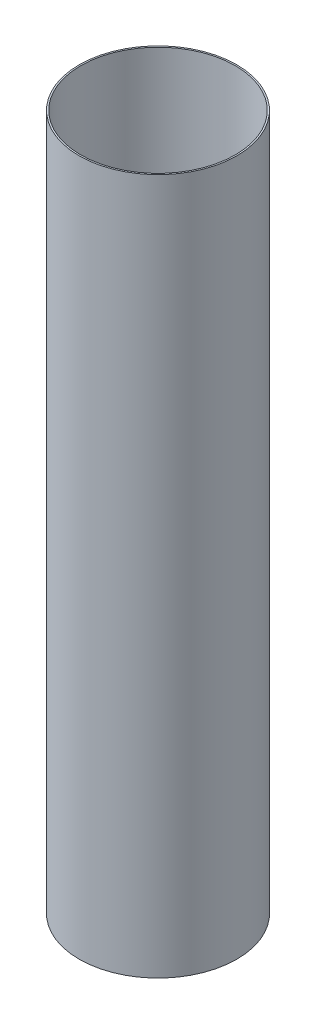
ISO-10303-21;
HEADER;
FILE_DESCRIPTION(('STEP AP214'),'2;1');
FILE_NAME('part.step','',(''),(''),'','','');
FILE_SCHEMA(('AUTOMOTIVE_DESIGN { 1 0 10303 214 1 1 1 1 }'));
ENDSEC;
DATA;
#1=APPLICATION_CONTEXT('core data for automotive mechanical design processes');
#2=APPLICATION_PROTOCOL_DEFINITION('international standard','automotive_design',2000,#1);
#3=PRODUCT_CONTEXT('',#1,'mechanical');
#4=PRODUCT('Part','Part','',(#3));
#5=PRODUCT_RELATED_PRODUCT_CATEGORY('part','',(#4));
#6=PRODUCT_DEFINITION_FORMATION('','',#4);
#7=PRODUCT_DEFINITION_CONTEXT('part definition',#1,'design');
#8=PRODUCT_DEFINITION('design','',#6,#7);
#9=PRODUCT_DEFINITION_SHAPE('','',#8);
#10=(LENGTH_UNIT() NAMED_UNIT(*) SI_UNIT(.MILLI.,.METRE.));
#11=(NAMED_UNIT(*) PLANE_ANGLE_UNIT() SI_UNIT($,.RADIAN.));
#12=(NAMED_UNIT(*) SI_UNIT($,.STERADIAN.) SOLID_ANGLE_UNIT());
#13=UNCERTAINTY_MEASURE_WITH_UNIT(LENGTH_MEASURE(1.E-05),#10,'distance_accuracy_value','');
#14=(GEOMETRIC_REPRESENTATION_CONTEXT(3) GLOBAL_UNCERTAINTY_ASSIGNED_CONTEXT((#13)) GLOBAL_UNIT_ASSIGNED_CONTEXT((#10,
#11,#12)) REPRESENTATION_CONTEXT('',''));
#15=CARTESIAN_POINT('',(0.,0.,0.));
#16=DIRECTION('',(0.,0.,1.));
#17=DIRECTION('',(1.,0.,0.));
#18=AXIS2_PLACEMENT_3D('',#15,#16,#17);
#19=CARTESIAN_POINT('',(0.,450.,0.));
#20=DIRECTION('',(0.,1.,0.));
#21=DIRECTION('',(0.,0.,1.));
#22=AXIS2_PLACEMENT_3D('',#19,#20,#21);
#23=PLANE('',#22);
#24=CARTESIAN_POINT('',(0.,450.,0.));
#25=DIRECTION('',(0.,1.,0.));
#26=DIRECTION('',(0.,0.,1.));
#27=AXIS2_PLACEMENT_3D('',#24,#25,#26);
#28=CIRCLE('',#27,51.);
#29=CARTESIAN_POINT('',(0.,450.,51.));
#30=VERTEX_POINT('',#29);
#31=EDGE_CURVE('E10',#30,#30,#28,.T.);
#32=ORIENTED_EDGE('',*,*,#31,.T.);
#33=EDGE_LOOP('',(#32));
#34=FACE_BOUND('',#33,.T.);
#35=CARTESIAN_POINT('',(0.,450.,0.));
#36=DIRECTION('',(0.,1.,0.));
#37=DIRECTION('',(0.,0.,1.));
#38=AXIS2_PLACEMENT_3D('',#35,#36,#37);
#39=CIRCLE('',#38,50.);
#40=CARTESIAN_POINT('',(0.,450.,50.));
#41=VERTEX_POINT('',#40);
#42=EDGE_CURVE('E54',#41,#41,#39,.T.);
#43=ORIENTED_EDGE('',*,*,#42,.F.);
#44=EDGE_LOOP('',(#43));
#45=FACE_BOUND('',#44,.T.);
#46=ADVANCED_FACE('F41',(#34,#45),#23,.T.);
#47=CARTESIAN_POINT('',(0.,0.,0.));
#48=DIRECTION('',(0.,1.,0.));
#49=DIRECTION('',(0.,0.,1.));
#50=AXIS2_PLACEMENT_3D('',#47,#48,#49);
#51=PLANE('',#50);
#52=CARTESIAN_POINT('',(0.,0.,0.));
#53=DIRECTION('',(0.,1.,0.));
#54=DIRECTION('',(0.,0.,1.));
#55=AXIS2_PLACEMENT_3D('',#52,#53,#54);
#56=CIRCLE('',#55,51.);
#57=CARTESIAN_POINT('',(0.,0.,51.));
#58=VERTEX_POINT('',#57);
#59=EDGE_CURVE('E45',#58,#58,#56,.T.);
#60=ORIENTED_EDGE('',*,*,#59,.F.);
#61=EDGE_LOOP('',(#60));
#62=FACE_BOUND('',#61,.T.);
#63=CARTESIAN_POINT('',(0.,0.,0.));
#64=DIRECTION('',(0.,1.,0.));
#65=DIRECTION('',(0.,0.,1.));
#66=AXIS2_PLACEMENT_3D('',#63,#64,#65);
#67=CIRCLE('',#66,50.);
#68=CARTESIAN_POINT('',(0.,0.,50.));
#69=VERTEX_POINT('',#68);
#70=EDGE_CURVE('E56',#69,#69,#67,.T.);
#71=ORIENTED_EDGE('',*,*,#70,.T.);
#72=EDGE_LOOP('',(#71));
#73=FACE_BOUND('',#72,.T.);
#74=ADVANCED_FACE('F68',(#62,#73),#51,.F.);
#75=CARTESIAN_POINT('',(0.,450.,0.));
#76=DIRECTION('',(0.,-1.,0.));
#77=DIRECTION('',(0.,0.,-1.));
#78=AXIS2_PLACEMENT_3D('',#75,#76,#77);
#79=CYLINDRICAL_SURFACE('',#78,51.);
#80=ORIENTED_EDGE('',*,*,#31,.F.);
#81=EDGE_LOOP('',(#80));
#82=FACE_BOUND('',#81,.T.);
#83=ORIENTED_EDGE('',*,*,#59,.T.);
#84=EDGE_LOOP('',(#83));
#85=FACE_BOUND('',#84,.T.);
#86=ADVANCED_FACE('F43',(#82,#85),#79,.T.);
#87=CARTESIAN_POINT('',(0.,450.,0.));
#88=DIRECTION('',(0.,-1.,0.));
#89=DIRECTION('',(0.,0.,-1.));
#90=AXIS2_PLACEMENT_3D('',#87,#88,#89);
#91=CYLINDRICAL_SURFACE('',#90,50.);
#92=ORIENTED_EDGE('',*,*,#42,.T.);
#93=EDGE_LOOP('',(#92));
#94=FACE_BOUND('',#93,.T.);
#95=ORIENTED_EDGE('',*,*,#70,.F.);
#96=EDGE_LOOP('',(#95));
#97=FACE_BOUND('',#96,.T.);
#98=ADVANCED_FACE('F64',(#94,#97),#91,.F.);
#99=CLOSED_SHELL('',(#46,#74,#86,#98));
#100=MANIFOLD_SOLID_BREP('B2',#99);
#101=ADVANCED_BREP_SHAPE_REPRESENTATION('',(#18,#100),#14);
#102=SHAPE_DEFINITION_REPRESENTATION(#9,#101);
ENDSEC;
END-ISO-10303-21;
